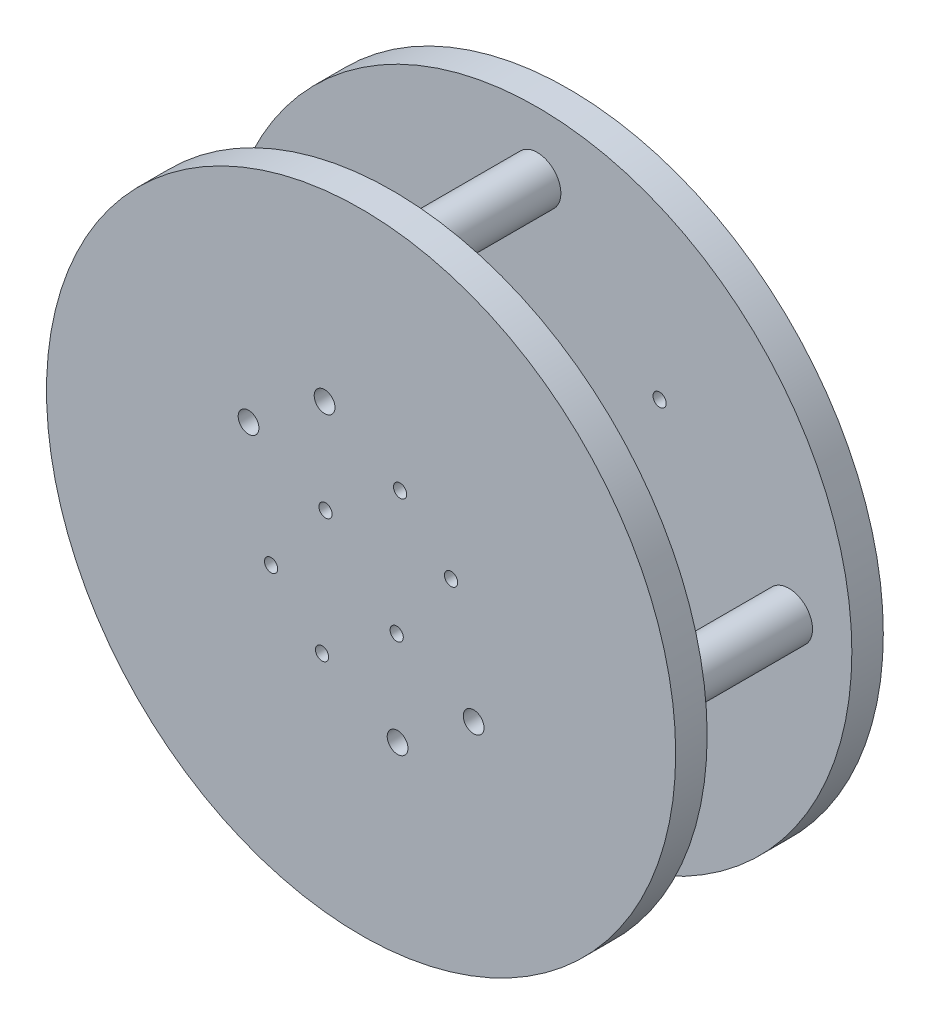
ISO-10303-21;
HEADER;
FILE_DESCRIPTION(('STEP AP214'),'2;1');
FILE_NAME('part.step','',(''),(''),'','','');
FILE_SCHEMA(('AUTOMOTIVE_DESIGN { 1 0 10303 214 1 1 1 1 }'));
ENDSEC;
DATA;
#1=APPLICATION_CONTEXT('core data for automotive mechanical design processes');
#2=APPLICATION_PROTOCOL_DEFINITION('international standard','automotive_design',2000,#1);
#3=PRODUCT_CONTEXT('',#1,'mechanical');
#4=PRODUCT('Part','Part','',(#3));
#5=PRODUCT_RELATED_PRODUCT_CATEGORY('part','',(#4));
#6=PRODUCT_DEFINITION_FORMATION('','',#4);
#7=PRODUCT_DEFINITION_CONTEXT('part definition',#1,'design');
#8=PRODUCT_DEFINITION('design','',#6,#7);
#9=PRODUCT_DEFINITION_SHAPE('','',#8);
#10=(LENGTH_UNIT() NAMED_UNIT(*) SI_UNIT(.MILLI.,.METRE.));
#11=(NAMED_UNIT(*) PLANE_ANGLE_UNIT() SI_UNIT($,.RADIAN.));
#12=(NAMED_UNIT(*) SI_UNIT($,.STERADIAN.) SOLID_ANGLE_UNIT());
#13=UNCERTAINTY_MEASURE_WITH_UNIT(LENGTH_MEASURE(1.E-05),#10,'distance_accuracy_value','');
#14=(GEOMETRIC_REPRESENTATION_CONTEXT(3) GLOBAL_UNCERTAINTY_ASSIGNED_CONTEXT((#13)) GLOBAL_UNIT_ASSIGNED_CONTEXT((#10,
#11,#12)) REPRESENTATION_CONTEXT('',''));
#15=CARTESIAN_POINT('',(0.,0.,0.));
#16=DIRECTION('',(0.,0.,1.));
#17=DIRECTION('',(1.,0.,0.));
#18=AXIS2_PLACEMENT_3D('',#15,#16,#17);
#19=CARTESIAN_POINT('',(0.,0.,10.));
#20=DIRECTION('',(0.,0.,1.));
#21=DIRECTION('',(1.,0.,0.));
#22=AXIS2_PLACEMENT_3D('',#19,#20,#21);
#23=PLANE('',#22);
#24=CARTESIAN_POINT('',(38.8908729652598,38.8908729652604,10.));
#25=DIRECTION('',(0.,0.,1.));
#26=DIRECTION('',(1.,0.,0.));
#27=AXIS2_PLACEMENT_3D('',#24,#25,#26);
#28=CIRCLE('',#27,2.09999999999998);
#29=CARTESIAN_POINT('',(40.9908729652598,38.8908729652604,10.));
#30=VERTEX_POINT('',#29);
#31=EDGE_CURVE('E527',#30,#30,#28,.T.);
#32=ORIENTED_EDGE('',*,*,#31,.F.);
#33=EDGE_LOOP('',(#32));
#34=FACE_BOUND('',#33,.T.);
#35=CARTESIAN_POINT('',(38.89087296526,-38.8908729652602,10.));
#36=DIRECTION('',(0.,0.,1.));
#37=DIRECTION('',(1.,0.,0.));
#38=AXIS2_PLACEMENT_3D('',#35,#36,#37);
#39=CIRCLE('',#38,2.09999999999998);
#40=CARTESIAN_POINT('',(40.99087296526,-38.8908729652602,10.));
#41=VERTEX_POINT('',#40);
#42=EDGE_CURVE('E529',#41,#41,#39,.T.);
#43=ORIENTED_EDGE('',*,*,#42,.F.);
#44=EDGE_LOOP('',(#43));
#45=FACE_BOUND('',#44,.T.);
#46=CARTESIAN_POINT('',(-38.89087296526,-38.8908729652602,10.));
#47=DIRECTION('',(0.,0.,1.));
#48=DIRECTION('',(1.,0.,0.));
#49=AXIS2_PLACEMENT_3D('',#46,#47,#48);
#50=CIRCLE('',#49,2.09999999999999);
#51=CARTESIAN_POINT('',(-36.7908729652601,-38.8908729652602,10.));
#52=VERTEX_POINT('',#51);
#53=EDGE_CURVE('E535',#52,#52,#50,.T.);
#54=ORIENTED_EDGE('',*,*,#53,.F.);
#55=EDGE_LOOP('',(#54));
#56=FACE_BOUND('',#55,.T.);
#57=CARTESIAN_POINT('',(-38.89087296526,38.8908729652602,10.));
#58=DIRECTION('',(0.,0.,1.));
#59=DIRECTION('',(1.,0.,0.));
#60=AXIS2_PLACEMENT_3D('',#57,#58,#59);
#61=CIRCLE('',#60,2.09999999999998);
#62=CARTESIAN_POINT('',(-36.7908729652601,38.8908729652602,10.));
#63=VERTEX_POINT('',#62);
#64=EDGE_CURVE('E538',#63,#63,#61,.T.);
#65=ORIENTED_EDGE('',*,*,#64,.F.);
#66=EDGE_LOOP('',(#65));
#67=FACE_BOUND('',#66,.T.);
#68=CARTESIAN_POINT('',(-28.6095403668078,-12.402652942012,10.));
#69=DIRECTION('',(0.,0.,1.));
#70=DIRECTION('',(1.,0.,0.));
#71=AXIS2_PLACEMENT_3D('',#68,#69,#70);
#72=CIRCLE('',#71,2.1);
#73=CARTESIAN_POINT('',(-26.5095403668078,-12.402652942012,10.));
#74=VERTEX_POINT('',#73);
#75=EDGE_CURVE('E72',#74,#74,#72,.F.);
#76=ORIENTED_EDGE('',*,*,#75,.T.);
#77=EDGE_LOOP('',(#76));
#78=FACE_BOUND('',#77,.T.);
#79=CARTESIAN_POINT('',(28.6095403668077,12.402652942012,10.));
#80=DIRECTION('',(0.,0.,1.));
#81=DIRECTION('',(1.,0.,0.));
#82=AXIS2_PLACEMENT_3D('',#79,#80,#81);
#83=CIRCLE('',#82,2.09999999999999);
#84=CARTESIAN_POINT('',(30.7095403668077,12.402652942012,10.));
#85=VERTEX_POINT('',#84);
#86=EDGE_CURVE('E53',#85,#85,#83,.F.);
#87=ORIENTED_EDGE('',*,*,#86,.T.);
#88=EDGE_LOOP('',(#87));
#89=FACE_BOUND('',#88,.T.);
#90=CARTESIAN_POINT('',(-8.37955521322352E-13,-80.,10.));
#91=DIRECTION('',(0.,0.,1.));
#92=DIRECTION('',(1.,0.,0.));
#93=AXIS2_PLACEMENT_3D('',#90,#91,#92);
#94=CIRCLE('',#93,7.50000000000002);
#95=CARTESIAN_POINT('',(7.49999999999918,-80.,10.));
#96=VERTEX_POINT('',#95);
#97=EDGE_CURVE('E91',#96,#96,#94,.T.);
#98=ORIENTED_EDGE('',*,*,#97,.F.);
#99=EDGE_LOOP('',(#98));
#100=FACE_BOUND('',#99,.T.);
#101=CARTESIAN_POINT('',(80.,-5.58637014214901E-13,10.));
#102=DIRECTION('',(0.,0.,1.));
#103=DIRECTION('',(1.,0.,0.));
#104=AXIS2_PLACEMENT_3D('',#101,#102,#103);
#105=CIRCLE('',#104,7.50000000000001);
#106=CARTESIAN_POINT('',(87.5,-5.58637014214901E-13,10.));
#107=VERTEX_POINT('',#106);
#108=EDGE_CURVE('E97',#107,#107,#105,.T.);
#109=ORIENTED_EDGE('',*,*,#108,.F.);
#110=EDGE_LOOP('',(#109));
#111=FACE_BOUND('',#110,.T.);
#112=CARTESIAN_POINT('',(2.79318507107451E-13,80.,10.));
#113=DIRECTION('',(0.,0.,1.));
#114=DIRECTION('',(1.,0.,0.));
#115=AXIS2_PLACEMENT_3D('',#112,#113,#114);
#116=CIRCLE('',#115,7.50000000000002);
#117=CARTESIAN_POINT('',(7.5000000000003,80.,10.));
#118=VERTEX_POINT('',#117);
#119=EDGE_CURVE('E103',#118,#118,#116,.T.);
#120=ORIENTED_EDGE('',*,*,#119,.F.);
#121=EDGE_LOOP('',(#120));
#122=FACE_BOUND('',#121,.T.);
#123=CARTESIAN_POINT('',(-80.,0.,10.));
#124=DIRECTION('',(0.,0.,1.));
#125=DIRECTION('',(1.,0.,0.));
#126=AXIS2_PLACEMENT_3D('',#123,#124,#125);
#127=CIRCLE('',#126,7.50000000000001);
#128=CARTESIAN_POINT('',(-72.5,0.,10.));
#129=VERTEX_POINT('',#128);
#130=EDGE_CURVE('E47',#129,#129,#127,.T.);
#131=ORIENTED_EDGE('',*,*,#130,.F.);
#132=EDGE_LOOP('',(#131));
#133=FACE_BOUND('',#132,.T.);
#134=CARTESIAN_POINT('',(0.,0.,10.));
#135=DIRECTION('',(0.,0.,1.));
#136=DIRECTION('',(1.,0.,0.));
#137=AXIS2_PLACEMENT_3D('',#134,#135,#136);
#138=CIRCLE('',#137,100.);
#139=CARTESIAN_POINT('',(100.,0.,10.));
#140=VERTEX_POINT('',#139);
#141=EDGE_CURVE('E10',#140,#140,#138,.T.);
#142=ORIENTED_EDGE('',*,*,#141,.T.);
#143=EDGE_LOOP('',(#142));
#144=FACE_BOUND('',#143,.T.);
#145=CARTESIAN_POINT('',(12.402652942012,28.6095403668077,10.));
#146=DIRECTION('',(0.,0.,1.));
#147=DIRECTION('',(1.,0.,0.));
#148=AXIS2_PLACEMENT_3D('',#145,#146,#147);
#149=CIRCLE('',#148,2.1);
#150=CARTESIAN_POINT('',(14.502652942012,28.6095403668077,10.));
#151=VERTEX_POINT('',#150);
#152=EDGE_CURVE('E57',#151,#151,#149,.T.);
#153=ORIENTED_EDGE('',*,*,#152,.F.);
#154=EDGE_LOOP('',(#153));
#155=FACE_BOUND('',#154,.T.);
#156=CARTESIAN_POINT('',(-12.4026529420121,-28.6095403668077,10.));
#157=DIRECTION('',(0.,0.,1.));
#158=DIRECTION('',(1.,0.,0.));
#159=AXIS2_PLACEMENT_3D('',#156,#157,#158);
#160=CIRCLE('',#159,2.09999999999997);
#161=CARTESIAN_POINT('',(-10.3026529420121,-28.6095403668077,10.));
#162=VERTEX_POINT('',#161);
#163=EDGE_CURVE('E60',#162,#162,#160,.T.);
#164=ORIENTED_EDGE('',*,*,#163,.F.);
#165=EDGE_LOOP('',(#164));
#166=FACE_BOUND('',#165,.T.);
#167=ADVANCED_FACE('F31',(#34,#45,#56,#67,#78,#89,#100,#111,#122,#133,#144,#155,#166),#23,.T.);
#168=CARTESIAN_POINT('',(0.,0.,0.));
#169=DIRECTION('',(0.,0.,1.));
#170=DIRECTION('',(1.,0.,0.));
#171=AXIS2_PLACEMENT_3D('',#168,#169,#170);
#172=PLANE('',#171);
#173=CARTESIAN_POINT('',(38.8908729652598,38.8908729652604,0.));
#174=DIRECTION('',(0.,0.,1.));
#175=DIRECTION('',(1.,0.,0.));
#176=AXIS2_PLACEMENT_3D('',#173,#174,#175);
#177=CIRCLE('',#176,2.09999999999999);
#178=CARTESIAN_POINT('',(40.9908729652598,38.8908729652604,0.));
#179=VERTEX_POINT('',#178);
#180=EDGE_CURVE('E259',#179,#179,#177,.T.);
#181=ORIENTED_EDGE('',*,*,#180,.T.);
#182=EDGE_LOOP('',(#181));
#183=FACE_BOUND('',#182,.T.);
#184=CARTESIAN_POINT('',(38.89087296526,-38.8908729652602,0.));
#185=DIRECTION('',(0.,0.,1.));
#186=DIRECTION('',(1.,0.,0.));
#187=AXIS2_PLACEMENT_3D('',#184,#185,#186);
#188=CIRCLE('',#187,2.09999999999999);
#189=CARTESIAN_POINT('',(40.99087296526,-38.8908729652602,0.));
#190=VERTEX_POINT('',#189);
#191=EDGE_CURVE('E263',#190,#190,#188,.T.);
#192=ORIENTED_EDGE('',*,*,#191,.T.);
#193=EDGE_LOOP('',(#192));
#194=FACE_BOUND('',#193,.T.);
#195=CARTESIAN_POINT('',(-38.89087296526,-38.8908729652602,0.));
#196=DIRECTION('',(0.,0.,1.));
#197=DIRECTION('',(1.,0.,0.));
#198=AXIS2_PLACEMENT_3D('',#195,#196,#197);
#199=CIRCLE('',#198,2.09999999999999);
#200=CARTESIAN_POINT('',(-36.7908729652601,-38.8908729652602,0.));
#201=VERTEX_POINT('',#200);
#202=EDGE_CURVE('E267',#201,#201,#199,.T.);
#203=ORIENTED_EDGE('',*,*,#202,.T.);
#204=EDGE_LOOP('',(#203));
#205=FACE_BOUND('',#204,.T.);
#206=CARTESIAN_POINT('',(-38.89087296526,38.8908729652602,0.));
#207=DIRECTION('',(0.,0.,1.));
#208=DIRECTION('',(1.,0.,0.));
#209=AXIS2_PLACEMENT_3D('',#206,#207,#208);
#210=CIRCLE('',#209,2.09999999999999);
#211=CARTESIAN_POINT('',(-36.79087296526,38.8908729652602,0.));
#212=VERTEX_POINT('',#211);
#213=EDGE_CURVE('E166',#212,#212,#210,.T.);
#214=ORIENTED_EDGE('',*,*,#213,.T.);
#215=EDGE_LOOP('',(#214));
#216=FACE_BOUND('',#215,.T.);
#217=CARTESIAN_POINT('',(-28.6095403668078,-12.402652942012,0.));
#218=DIRECTION('',(0.,0.,-1.));
#219=DIRECTION('',(-1.,0.,0.));
#220=AXIS2_PLACEMENT_3D('',#217,#218,#219);
#221=CIRCLE('',#220,2.1);
#222=CARTESIAN_POINT('',(-30.7095403668078,-12.402652942012,0.));
#223=VERTEX_POINT('',#222);
#224=EDGE_CURVE('E54',#223,#223,#221,.T.);
#225=ORIENTED_EDGE('',*,*,#224,.F.);
#226=EDGE_LOOP('',(#225));
#227=FACE_BOUND('',#226,.T.);
#228=CARTESIAN_POINT('',(12.402652942012,28.6095403668077,0.));
#229=DIRECTION('',(0.,0.,1.));
#230=DIRECTION('',(1.,0.,0.));
#231=AXIS2_PLACEMENT_3D('',#228,#229,#230);
#232=CIRCLE('',#231,2.1);
#233=CARTESIAN_POINT('',(14.502652942012,28.6095403668077,0.));
#234=VERTEX_POINT('',#233);
#235=EDGE_CURVE('E144',#234,#234,#232,.T.);
#236=ORIENTED_EDGE('',*,*,#235,.T.);
#237=EDGE_LOOP('',(#236));
#238=FACE_BOUND('',#237,.T.);
#239=CARTESIAN_POINT('',(28.6095403668077,12.402652942012,0.));
#240=DIRECTION('',(0.,0.,-1.));
#241=DIRECTION('',(-1.,0.,0.));
#242=AXIS2_PLACEMENT_3D('',#239,#240,#241);
#243=CIRCLE('',#242,2.09999999999999);
#244=CARTESIAN_POINT('',(26.5095403668077,12.402652942012,0.));
#245=VERTEX_POINT('',#244);
#246=EDGE_CURVE('E152',#245,#245,#243,.T.);
#247=ORIENTED_EDGE('',*,*,#246,.F.);
#248=EDGE_LOOP('',(#247));
#249=FACE_BOUND('',#248,.T.);
#250=CARTESIAN_POINT('',(0.,0.,0.));
#251=DIRECTION('',(0.,0.,1.));
#252=DIRECTION('',(1.,0.,0.));
#253=AXIS2_PLACEMENT_3D('',#250,#251,#252);
#254=CIRCLE('',#253,100.);
#255=CARTESIAN_POINT('',(100.,0.,0.));
#256=VERTEX_POINT('',#255);
#257=EDGE_CURVE('E39',#256,#256,#254,.T.);
#258=ORIENTED_EDGE('',*,*,#257,.F.);
#259=EDGE_LOOP('',(#258));
#260=FACE_BOUND('',#259,.T.);
#261=CARTESIAN_POINT('',(-12.4026529420121,-28.6095403668077,0.));
#262=DIRECTION('',(0.,0.,1.));
#263=DIRECTION('',(1.,0.,0.));
#264=AXIS2_PLACEMENT_3D('',#261,#262,#263);
#265=CIRCLE('',#264,2.09999999999997);
#266=CARTESIAN_POINT('',(-10.3026529420121,-28.6095403668077,0.));
#267=VERTEX_POINT('',#266);
#268=EDGE_CURVE('E135',#267,#267,#265,.T.);
#269=ORIENTED_EDGE('',*,*,#268,.T.);
#270=EDGE_LOOP('',(#269));
#271=FACE_BOUND('',#270,.T.);
#272=ADVANCED_FACE('F119',(#183,#194,#205,#216,#227,#238,#249,#260,#271),#172,.F.);
#273=CARTESIAN_POINT('',(0.,0.,66.));
#274=DIRECTION('',(0.,0.,1.));
#275=DIRECTION('',(1.,0.,0.));
#276=AXIS2_PLACEMENT_3D('',#273,#274,#275);
#277=PLANE('',#276);
#278=CARTESIAN_POINT('',(-11.601229272386,41.1146139392022,66.));
#279=DIRECTION('',(0.,0.,1.));
#280=DIRECTION('',(1.,0.,0.));
#281=AXIS2_PLACEMENT_3D('',#278,#279,#280);
#282=CIRCLE('',#281,3.29999999999999);
#283=CARTESIAN_POINT('',(-8.30122927238597,41.1146139392022,66.));
#284=VERTEX_POINT('',#283);
#285=EDGE_CURVE('E158',#284,#284,#282,.T.);
#286=ORIENTED_EDGE('',*,*,#285,.F.);
#287=EDGE_LOOP('',(#286));
#288=FACE_BOUND('',#287,.T.);
#289=CARTESIAN_POINT('',(-35.7749188912724,23.3485583778306,66.));
#290=DIRECTION('',(0.,0.,1.));
#291=DIRECTION('',(1.,0.,0.));
#292=AXIS2_PLACEMENT_3D('',#289,#290,#291);
#293=CIRCLE('',#292,3.3);
#294=CARTESIAN_POINT('',(-32.4749188912724,23.3485583778306,66.));
#295=VERTEX_POINT('',#294);
#296=EDGE_CURVE('E171',#295,#295,#293,.T.);
#297=ORIENTED_EDGE('',*,*,#296,.F.);
#298=EDGE_LOOP('',(#297));
#299=FACE_BOUND('',#298,.T.);
#300=CARTESIAN_POINT('',(11.6012292723852,-41.1146139391999,66.));
#301=DIRECTION('',(0.,0.,1.));
#302=DIRECTION('',(1.,0.,0.));
#303=AXIS2_PLACEMENT_3D('',#300,#301,#302);
#304=CIRCLE('',#303,3.3);
#305=CARTESIAN_POINT('',(14.9012292723852,-41.1146139391999,66.));
#306=VERTEX_POINT('',#305);
#307=EDGE_CURVE('E177',#306,#306,#304,.T.);
#308=ORIENTED_EDGE('',*,*,#307,.F.);
#309=EDGE_LOOP('',(#308));
#310=FACE_BOUND('',#309,.T.);
#311=CARTESIAN_POINT('',(35.7749188912716,-23.3485583778283,66.));
#312=DIRECTION('',(0.,0.,1.));
#313=DIRECTION('',(1.,0.,0.));
#314=AXIS2_PLACEMENT_3D('',#311,#312,#313);
#315=CIRCLE('',#314,3.29999999999999);
#316=CARTESIAN_POINT('',(39.0749188912716,-23.3485583778283,66.));
#317=VERTEX_POINT('',#316);
#318=EDGE_CURVE('E183',#317,#317,#315,.T.);
#319=ORIENTED_EDGE('',*,*,#318,.F.);
#320=EDGE_LOOP('',(#319));
#321=FACE_BOUND('',#320,.T.);
#322=CARTESIAN_POINT('',(-28.6095403668078,-12.402652942012,66.));
#323=DIRECTION('',(0.,0.,-1.));
#324=DIRECTION('',(-1.,0.,0.));
#325=AXIS2_PLACEMENT_3D('',#322,#323,#324);
#326=CIRCLE('',#325,2.1);
#327=CARTESIAN_POINT('',(-30.7095403668078,-12.402652942012,66.));
#328=VERTEX_POINT('',#327);
#329=EDGE_CURVE('E141',#328,#328,#326,.T.);
#330=ORIENTED_EDGE('',*,*,#329,.T.);
#331=EDGE_LOOP('',(#330));
#332=FACE_BOUND('',#331,.T.);
#333=CARTESIAN_POINT('',(28.6095403668077,12.402652942012,66.));
#334=DIRECTION('',(0.,0.,-1.));
#335=DIRECTION('',(-1.,0.,0.));
#336=AXIS2_PLACEMENT_3D('',#333,#334,#335);
#337=CIRCLE('',#336,2.09999999999999);
#338=CARTESIAN_POINT('',(26.5095403668077,12.402652942012,66.));
#339=VERTEX_POINT('',#338);
#340=EDGE_CURVE('E150',#339,#339,#337,.T.);
#341=ORIENTED_EDGE('',*,*,#340,.T.);
#342=EDGE_LOOP('',(#341));
#343=FACE_BOUND('',#342,.T.);
#344=CARTESIAN_POINT('',(-11.3137084989848,11.3137084989848,66.));
#345=DIRECTION('',(0.,0.,1.));
#346=DIRECTION('',(1.,0.,0.));
#347=AXIS2_PLACEMENT_3D('',#344,#345,#346);
#348=CIRCLE('',#347,2.1);
#349=CARTESIAN_POINT('',(-9.21370849898477,11.3137084989848,66.));
#350=VERTEX_POINT('',#349);
#351=EDGE_CURVE('E80',#350,#350,#348,.T.);
#352=ORIENTED_EDGE('',*,*,#351,.F.);
#353=EDGE_LOOP('',(#352));
#354=FACE_BOUND('',#353,.T.);
#355=CARTESIAN_POINT('',(11.3137084989848,-11.3137084989848,66.));
#356=DIRECTION('',(0.,0.,1.));
#357=DIRECTION('',(1.,0.,0.));
#358=AXIS2_PLACEMENT_3D('',#355,#356,#357);
#359=CIRCLE('',#358,2.1);
#360=CARTESIAN_POINT('',(13.4137084989848,-11.3137084989848,66.));
#361=VERTEX_POINT('',#360);
#362=EDGE_CURVE('E83',#361,#361,#359,.T.);
#363=ORIENTED_EDGE('',*,*,#362,.F.);
#364=EDGE_LOOP('',(#363));
#365=FACE_BOUND('',#364,.T.);
#366=CARTESIAN_POINT('',(0.,0.,66.));
#367=DIRECTION('',(0.,0.,1.));
#368=DIRECTION('',(1.,0.,0.));
#369=AXIS2_PLACEMENT_3D('',#366,#367,#368);
#370=CIRCLE('',#369,100.);
#371=CARTESIAN_POINT('',(100.,0.,66.));
#372=VERTEX_POINT('',#371);
#373=EDGE_CURVE('E88',#372,#372,#370,.T.);
#374=ORIENTED_EDGE('',*,*,#373,.T.);
#375=EDGE_LOOP('',(#374));
#376=FACE_BOUND('',#375,.T.);
#377=CARTESIAN_POINT('',(12.402652942012,28.6095403668077,66.));
#378=DIRECTION('',(0.,0.,1.));
#379=DIRECTION('',(1.,0.,0.));
#380=AXIS2_PLACEMENT_3D('',#377,#378,#379);
#381=CIRCLE('',#380,2.1);
#382=CARTESIAN_POINT('',(14.502652942012,28.6095403668077,66.));
#383=VERTEX_POINT('',#382);
#384=EDGE_CURVE('E138',#383,#383,#381,.T.);
#385=ORIENTED_EDGE('',*,*,#384,.F.);
#386=EDGE_LOOP('',(#385));
#387=FACE_BOUND('',#386,.T.);
#388=CARTESIAN_POINT('',(-12.4026529420121,-28.6095403668077,66.));
#389=DIRECTION('',(0.,0.,1.));
#390=DIRECTION('',(1.,0.,0.));
#391=AXIS2_PLACEMENT_3D('',#388,#389,#390);
#392=CIRCLE('',#391,2.09999999999997);
#393=CARTESIAN_POINT('',(-10.3026529420121,-28.6095403668077,66.));
#394=VERTEX_POINT('',#393);
#395=EDGE_CURVE('E137',#394,#394,#392,.T.);
#396=ORIENTED_EDGE('',*,*,#395,.F.);
#397=EDGE_LOOP('',(#396));
#398=FACE_BOUND('',#397,.T.);
#399=ADVANCED_FACE('F190',(#288,#299,#310,#321,#332,#343,#354,#365,#376,#387,#398),#277,.T.);
#400=CARTESIAN_POINT('',(0.,0.,56.));
#401=DIRECTION('',(0.,0.,1.));
#402=DIRECTION('',(1.,0.,0.));
#403=AXIS2_PLACEMENT_3D('',#400,#401,#402);
#404=PLANE('',#403);
#405=CARTESIAN_POINT('',(-28.6095403668078,-12.402652942012,56.));
#406=DIRECTION('',(0.,0.,1.));
#407=DIRECTION('',(1.,0.,0.));
#408=AXIS2_PLACEMENT_3D('',#405,#406,#407);
#409=CIRCLE('',#408,2.1);
#410=CARTESIAN_POINT('',(-26.5095403668078,-12.402652942012,56.));
#411=VERTEX_POINT('',#410);
#412=EDGE_CURVE('E35',#411,#411,#409,.F.);
#413=ORIENTED_EDGE('',*,*,#412,.F.);
#414=EDGE_LOOP('',(#413));
#415=FACE_BOUND('',#414,.T.);
#416=CARTESIAN_POINT('',(12.402652942012,28.6095403668077,56.));
#417=DIRECTION('',(0.,0.,1.));
#418=DIRECTION('',(1.,0.,0.));
#419=AXIS2_PLACEMENT_3D('',#416,#417,#418);
#420=CIRCLE('',#419,2.1);
#421=CARTESIAN_POINT('',(14.502652942012,28.6095403668077,56.));
#422=VERTEX_POINT('',#421);
#423=EDGE_CURVE('E55',#422,#422,#420,.T.);
#424=ORIENTED_EDGE('',*,*,#423,.T.);
#425=EDGE_LOOP('',(#424));
#426=FACE_BOUND('',#425,.T.);
#427=CARTESIAN_POINT('',(28.6095403668077,12.402652942012,56.));
#428=DIRECTION('',(0.,0.,1.));
#429=DIRECTION('',(1.,0.,0.));
#430=AXIS2_PLACEMENT_3D('',#427,#428,#429);
#431=CIRCLE('',#430,2.09999999999999);
#432=CARTESIAN_POINT('',(30.7095403668077,12.402652942012,56.));
#433=VERTEX_POINT('',#432);
#434=EDGE_CURVE('E50',#433,#433,#431,.F.);
#435=ORIENTED_EDGE('',*,*,#434,.F.);
#436=EDGE_LOOP('',(#435));
#437=FACE_BOUND('',#436,.T.);
#438=CARTESIAN_POINT('',(-11.3137084989848,11.3137084989848,56.));
#439=DIRECTION('',(0.,0.,1.));
#440=DIRECTION('',(1.,0.,0.));
#441=AXIS2_PLACEMENT_3D('',#438,#439,#440);
#442=CIRCLE('',#441,2.1);
#443=CARTESIAN_POINT('',(-9.21370849898477,11.3137084989848,56.));
#444=VERTEX_POINT('',#443);
#445=EDGE_CURVE('E76',#444,#444,#442,.T.);
#446=ORIENTED_EDGE('',*,*,#445,.T.);
#447=EDGE_LOOP('',(#446));
#448=FACE_BOUND('',#447,.T.);
#449=CARTESIAN_POINT('',(11.3137084989848,-11.3137084989848,56.));
#450=DIRECTION('',(0.,0.,1.));
#451=DIRECTION('',(1.,0.,0.));
#452=AXIS2_PLACEMENT_3D('',#449,#450,#451);
#453=CIRCLE('',#452,2.1);
#454=CARTESIAN_POINT('',(13.4137084989848,-11.3137084989848,56.));
#455=VERTEX_POINT('',#454);
#456=EDGE_CURVE('E75',#455,#455,#453,.T.);
#457=ORIENTED_EDGE('',*,*,#456,.T.);
#458=EDGE_LOOP('',(#457));
#459=FACE_BOUND('',#458,.T.);
#460=CARTESIAN_POINT('',(-80.,0.,56.));
#461=DIRECTION('',(0.,0.,1.));
#462=DIRECTION('',(1.,0.,0.));
#463=AXIS2_PLACEMENT_3D('',#460,#461,#462);
#464=CIRCLE('',#463,7.50000000000001);
#465=CARTESIAN_POINT('',(-72.5,0.,56.));
#466=VERTEX_POINT('',#465);
#467=EDGE_CURVE('E44',#466,#466,#464,.T.);
#468=ORIENTED_EDGE('',*,*,#467,.T.);
#469=EDGE_LOOP('',(#468));
#470=FACE_BOUND('',#469,.T.);
#471=CARTESIAN_POINT('',(2.79318507107451E-13,80.,56.));
#472=DIRECTION('',(0.,0.,1.));
#473=DIRECTION('',(1.,0.,0.));
#474=AXIS2_PLACEMENT_3D('',#471,#472,#473);
#475=CIRCLE('',#474,7.50000000000002);
#476=CARTESIAN_POINT('',(7.5000000000003,80.,56.));
#477=VERTEX_POINT('',#476);
#478=EDGE_CURVE('E106',#477,#477,#475,.T.);
#479=ORIENTED_EDGE('',*,*,#478,.T.);
#480=EDGE_LOOP('',(#479));
#481=FACE_BOUND('',#480,.T.);
#482=CARTESIAN_POINT('',(80.,-5.58637014214901E-13,56.));
#483=DIRECTION('',(0.,0.,1.));
#484=DIRECTION('',(1.,0.,0.));
#485=AXIS2_PLACEMENT_3D('',#482,#483,#484);
#486=CIRCLE('',#485,7.50000000000001);
#487=CARTESIAN_POINT('',(87.5,-5.58637014214901E-13,56.));
#488=VERTEX_POINT('',#487);
#489=EDGE_CURVE('E100',#488,#488,#486,.T.);
#490=ORIENTED_EDGE('',*,*,#489,.T.);
#491=EDGE_LOOP('',(#490));
#492=FACE_BOUND('',#491,.T.);
#493=CARTESIAN_POINT('',(-8.37955521322352E-13,-80.,56.));
#494=DIRECTION('',(0.,0.,1.));
#495=DIRECTION('',(1.,0.,0.));
#496=AXIS2_PLACEMENT_3D('',#493,#494,#495);
#497=CIRCLE('',#496,7.50000000000002);
#498=CARTESIAN_POINT('',(7.49999999999918,-80.,56.));
#499=VERTEX_POINT('',#498);
#500=EDGE_CURVE('E94',#499,#499,#497,.T.);
#501=ORIENTED_EDGE('',*,*,#500,.T.);
#502=EDGE_LOOP('',(#501));
#503=FACE_BOUND('',#502,.T.);
#504=CARTESIAN_POINT('',(0.,0.,56.));
#505=DIRECTION('',(0.,0.,1.));
#506=DIRECTION('',(1.,0.,0.));
#507=AXIS2_PLACEMENT_3D('',#504,#505,#506);
#508=CIRCLE('',#507,100.);
#509=CARTESIAN_POINT('',(100.,0.,56.));
#510=VERTEX_POINT('',#509);
#511=EDGE_CURVE('E79',#510,#510,#508,.T.);
#512=ORIENTED_EDGE('',*,*,#511,.F.);
#513=EDGE_LOOP('',(#512));
#514=FACE_BOUND('',#513,.T.);
#515=CARTESIAN_POINT('',(-12.4026529420121,-28.6095403668077,56.));
#516=DIRECTION('',(0.,0.,1.));
#517=DIRECTION('',(1.,0.,0.));
#518=AXIS2_PLACEMENT_3D('',#515,#516,#517);
#519=CIRCLE('',#518,2.09999999999997);
#520=CARTESIAN_POINT('',(-10.3026529420121,-28.6095403668077,56.));
#521=VERTEX_POINT('',#520);
#522=EDGE_CURVE('E58',#521,#521,#519,.T.);
#523=ORIENTED_EDGE('',*,*,#522,.T.);
#524=EDGE_LOOP('',(#523));
#525=FACE_BOUND('',#524,.T.);
#526=ADVANCED_FACE('F201',(#415,#426,#437,#448,#459,#470,#481,#492,#503,#514,#525),#404,.F.);
#527=CARTESIAN_POINT('',(0.,0.,10.));
#528=DIRECTION('',(0.,0.,-1.));
#529=DIRECTION('',(-1.,0.,0.));
#530=AXIS2_PLACEMENT_3D('',#527,#528,#529);
#531=CYLINDRICAL_SURFACE('',#530,100.);
#532=ORIENTED_EDGE('',*,*,#141,.F.);
#533=EDGE_LOOP('',(#532));
#534=FACE_BOUND('',#533,.T.);
#535=ORIENTED_EDGE('',*,*,#257,.T.);
#536=EDGE_LOOP('',(#535));
#537=FACE_BOUND('',#536,.T.);
#538=ADVANCED_FACE('F33',(#534,#537),#531,.T.);
#539=CARTESIAN_POINT('',(-80.,0.,56.));
#540=DIRECTION('',(0.,0.,-1.));
#541=DIRECTION('',(-1.,0.,0.));
#542=AXIS2_PLACEMENT_3D('',#539,#540,#541);
#543=CYLINDRICAL_SURFACE('',#542,7.50000000000001);
#544=ORIENTED_EDGE('',*,*,#467,.F.);
#545=EDGE_LOOP('',(#544));
#546=FACE_BOUND('',#545,.T.);
#547=ORIENTED_EDGE('',*,*,#130,.T.);
#548=EDGE_LOOP('',(#547));
#549=FACE_BOUND('',#548,.T.);
#550=ADVANCED_FACE('F116',(#546,#549),#543,.T.);
#551=CARTESIAN_POINT('',(2.79318507107451E-13,80.,56.));
#552=DIRECTION('',(0.,0.,-1.));
#553=DIRECTION('',(-1.,0.,0.));
#554=AXIS2_PLACEMENT_3D('',#551,#552,#553);
#555=CYLINDRICAL_SURFACE('',#554,7.50000000000002);
#556=ORIENTED_EDGE('',*,*,#478,.F.);
#557=EDGE_LOOP('',(#556));
#558=FACE_BOUND('',#557,.T.);
#559=ORIENTED_EDGE('',*,*,#119,.T.);
#560=EDGE_LOOP('',(#559));
#561=FACE_BOUND('',#560,.T.);
#562=ADVANCED_FACE('F242',(#558,#561),#555,.T.);
#563=CARTESIAN_POINT('',(80.,-5.58637014214901E-13,56.));
#564=DIRECTION('',(0.,0.,-1.));
#565=DIRECTION('',(-1.,0.,0.));
#566=AXIS2_PLACEMENT_3D('',#563,#564,#565);
#567=CYLINDRICAL_SURFACE('',#566,7.50000000000001);
#568=ORIENTED_EDGE('',*,*,#489,.F.);
#569=EDGE_LOOP('',(#568));
#570=FACE_BOUND('',#569,.T.);
#571=ORIENTED_EDGE('',*,*,#108,.T.);
#572=EDGE_LOOP('',(#571));
#573=FACE_BOUND('',#572,.T.);
#574=ADVANCED_FACE('F234',(#570,#573),#567,.T.);
#575=CARTESIAN_POINT('',(-8.37955521322352E-13,-80.,56.));
#576=DIRECTION('',(0.,0.,-1.));
#577=DIRECTION('',(-1.,0.,0.));
#578=AXIS2_PLACEMENT_3D('',#575,#576,#577);
#579=CYLINDRICAL_SURFACE('',#578,7.50000000000002);
#580=ORIENTED_EDGE('',*,*,#500,.F.);
#581=EDGE_LOOP('',(#580));
#582=FACE_BOUND('',#581,.T.);
#583=ORIENTED_EDGE('',*,*,#97,.T.);
#584=EDGE_LOOP('',(#583));
#585=FACE_BOUND('',#584,.T.);
#586=ADVANCED_FACE('F224',(#582,#585),#579,.T.);
#587=CARTESIAN_POINT('',(0.,0.,66.));
#588=DIRECTION('',(0.,0.,-1.));
#589=DIRECTION('',(-1.,0.,0.));
#590=AXIS2_PLACEMENT_3D('',#587,#588,#589);
#591=CYLINDRICAL_SURFACE('',#590,100.);
#592=ORIENTED_EDGE('',*,*,#373,.F.);
#593=EDGE_LOOP('',(#592));
#594=FACE_BOUND('',#593,.T.);
#595=ORIENTED_EDGE('',*,*,#511,.T.);
#596=EDGE_LOOP('',(#595));
#597=FACE_BOUND('',#596,.T.);
#598=ADVANCED_FACE('F221',(#594,#597),#591,.T.);
#599=CARTESIAN_POINT('',(11.3137084989848,-11.3137084989848,56.));
#600=DIRECTION('',(0.,0.,1.));
#601=DIRECTION('',(1.,0.,0.));
#602=AXIS2_PLACEMENT_3D('',#599,#600,#601);
#603=CYLINDRICAL_SURFACE('',#602,2.1);
#604=ORIENTED_EDGE('',*,*,#456,.F.);
#605=EDGE_LOOP('',(#604));
#606=FACE_BOUND('',#605,.T.);
#607=ORIENTED_EDGE('',*,*,#362,.T.);
#608=EDGE_LOOP('',(#607));
#609=FACE_BOUND('',#608,.T.);
#610=ADVANCED_FACE('F223',(#606,#609),#603,.F.);
#611=CARTESIAN_POINT('',(-11.3137084989848,11.3137084989848,56.));
#612=DIRECTION('',(0.,0.,1.));
#613=DIRECTION('',(1.,0.,0.));
#614=AXIS2_PLACEMENT_3D('',#611,#612,#613);
#615=CYLINDRICAL_SURFACE('',#614,2.1);
#616=ORIENTED_EDGE('',*,*,#445,.F.);
#617=EDGE_LOOP('',(#616));
#618=FACE_BOUND('',#617,.T.);
#619=ORIENTED_EDGE('',*,*,#351,.T.);
#620=EDGE_LOOP('',(#619));
#621=FACE_BOUND('',#620,.T.);
#622=ADVANCED_FACE('F231',(#618,#621),#615,.F.);
#623=CARTESIAN_POINT('',(28.6095403668077,12.402652942012,0.));
#624=DIRECTION('',(0.,0.,1.));
#625=DIRECTION('',(1.,0.,0.));
#626=AXIS2_PLACEMENT_3D('',#623,#624,#625);
#627=CYLINDRICAL_SURFACE('',#626,2.09999999999999);
#628=ORIENTED_EDGE('',*,*,#340,.F.);
#629=EDGE_LOOP('',(#628));
#630=FACE_BOUND('',#629,.T.);
#631=ORIENTED_EDGE('',*,*,#434,.T.);
#632=EDGE_LOOP('',(#631));
#633=FACE_BOUND('',#632,.T.);
#634=ADVANCED_FACE('F318',(#630,#633),#627,.F.);
#635=CARTESIAN_POINT('',(12.402652942012,28.6095403668077,0.));
#636=DIRECTION('',(0.,0.,1.));
#637=DIRECTION('',(1.,0.,0.));
#638=AXIS2_PLACEMENT_3D('',#635,#636,#637);
#639=CYLINDRICAL_SURFACE('',#638,2.1);
#640=ORIENTED_EDGE('',*,*,#384,.T.);
#641=EDGE_LOOP('',(#640));
#642=FACE_BOUND('',#641,.T.);
#643=ORIENTED_EDGE('',*,*,#423,.F.);
#644=EDGE_LOOP('',(#643));
#645=FACE_BOUND('',#644,.T.);
#646=ADVANCED_FACE('F334',(#642,#645),#639,.F.);
#647=CARTESIAN_POINT('',(-12.4026529420121,-28.6095403668077,0.));
#648=DIRECTION('',(0.,0.,1.));
#649=DIRECTION('',(1.,0.,0.));
#650=AXIS2_PLACEMENT_3D('',#647,#648,#649);
#651=CYLINDRICAL_SURFACE('',#650,2.09999999999997);
#652=ORIENTED_EDGE('',*,*,#395,.T.);
#653=EDGE_LOOP('',(#652));
#654=FACE_BOUND('',#653,.T.);
#655=ORIENTED_EDGE('',*,*,#522,.F.);
#656=EDGE_LOOP('',(#655));
#657=FACE_BOUND('',#656,.T.);
#658=ADVANCED_FACE('F132',(#654,#657),#651,.F.);
#659=CARTESIAN_POINT('',(-28.6095403668078,-12.402652942012,0.));
#660=DIRECTION('',(0.,0.,1.));
#661=DIRECTION('',(1.,0.,0.));
#662=AXIS2_PLACEMENT_3D('',#659,#660,#661);
#663=CYLINDRICAL_SURFACE('',#662,2.1);
#664=ORIENTED_EDGE('',*,*,#329,.F.);
#665=EDGE_LOOP('',(#664));
#666=FACE_BOUND('',#665,.T.);
#667=ORIENTED_EDGE('',*,*,#412,.T.);
#668=EDGE_LOOP('',(#667));
#669=FACE_BOUND('',#668,.T.);
#670=ADVANCED_FACE('F193',(#666,#669),#663,.F.);
#671=ORIENTED_EDGE('',*,*,#86,.F.);
#672=EDGE_LOOP('',(#671));
#673=FACE_BOUND('',#672,.T.);
#674=ORIENTED_EDGE('',*,*,#246,.T.);
#675=EDGE_LOOP('',(#674));
#676=FACE_BOUND('',#675,.T.);
#677=ADVANCED_FACE('F196',(#673,#676),#627,.F.);
#678=ORIENTED_EDGE('',*,*,#152,.T.);
#679=EDGE_LOOP('',(#678));
#680=FACE_BOUND('',#679,.T.);
#681=ORIENTED_EDGE('',*,*,#235,.F.);
#682=EDGE_LOOP('',(#681));
#683=FACE_BOUND('',#682,.T.);
#684=ADVANCED_FACE('F130',(#680,#683),#639,.F.);
#685=ORIENTED_EDGE('',*,*,#163,.T.);
#686=EDGE_LOOP('',(#685));
#687=FACE_BOUND('',#686,.T.);
#688=ORIENTED_EDGE('',*,*,#268,.F.);
#689=EDGE_LOOP('',(#688));
#690=FACE_BOUND('',#689,.T.);
#691=ADVANCED_FACE('F126',(#687,#690),#651,.F.);
#692=ORIENTED_EDGE('',*,*,#75,.F.);
#693=EDGE_LOOP('',(#692));
#694=FACE_BOUND('',#693,.T.);
#695=ORIENTED_EDGE('',*,*,#224,.T.);
#696=EDGE_LOOP('',(#695));
#697=FACE_BOUND('',#696,.T.);
#698=ADVANCED_FACE('F129',(#694,#697),#663,.F.);
#699=CARTESIAN_POINT('',(35.7749188912716,-23.3485583778283,61.));
#700=DIRECTION('',(0.,0.,1.));
#701=DIRECTION('',(1.,0.,0.));
#702=AXIS2_PLACEMENT_3D('',#699,#700,#701);
#703=CYLINDRICAL_SURFACE('',#702,3.29999999999999);
#704=CARTESIAN_POINT('',(35.7749188912716,-23.3485583778283,61.));
#705=DIRECTION('',(0.,0.,1.));
#706=DIRECTION('',(1.,0.,0.));
#707=AXIS2_PLACEMENT_3D('',#704,#705,#706);
#708=CIRCLE('',#707,3.29999999999999);
#709=CARTESIAN_POINT('',(39.0749188912716,-23.3485583778283,61.));
#710=VERTEX_POINT('',#709);
#711=EDGE_CURVE('E180',#710,#710,#708,.T.);
#712=ORIENTED_EDGE('',*,*,#711,.F.);
#713=EDGE_LOOP('',(#712));
#714=FACE_BOUND('',#713,.T.);
#715=ORIENTED_EDGE('',*,*,#318,.T.);
#716=EDGE_LOOP('',(#715));
#717=FACE_BOUND('',#716,.T.);
#718=ADVANCED_FACE('F389',(#714,#717),#703,.F.);
#719=CARTESIAN_POINT('',(35.7749188912716,-23.3485583778283,61.));
#720=DIRECTION('',(0.,0.,1.));
#721=DIRECTION('',(1.,0.,0.));
#722=AXIS2_PLACEMENT_3D('',#719,#720,#721);
#723=PLANE('',#722);
#724=ORIENTED_EDGE('',*,*,#711,.T.);
#725=EDGE_LOOP('',(#724));
#726=FACE_BOUND('',#725,.T.);
#727=ADVANCED_FACE('F404',(#726),#723,.T.);
#728=CARTESIAN_POINT('',(11.6012292723852,-41.1146139391999,61.));
#729=DIRECTION('',(0.,0.,1.));
#730=DIRECTION('',(1.,0.,0.));
#731=AXIS2_PLACEMENT_3D('',#728,#729,#730);
#732=CYLINDRICAL_SURFACE('',#731,3.3);
#733=CARTESIAN_POINT('',(11.6012292723852,-41.1146139391999,61.));
#734=DIRECTION('',(0.,0.,1.));
#735=DIRECTION('',(1.,0.,0.));
#736=AXIS2_PLACEMENT_3D('',#733,#734,#735);
#737=CIRCLE('',#736,3.3);
#738=CARTESIAN_POINT('',(14.9012292723852,-41.1146139391999,61.));
#739=VERTEX_POINT('',#738);
#740=EDGE_CURVE('E174',#739,#739,#737,.T.);
#741=ORIENTED_EDGE('',*,*,#740,.F.);
#742=EDGE_LOOP('',(#741));
#743=FACE_BOUND('',#742,.T.);
#744=ORIENTED_EDGE('',*,*,#307,.T.);
#745=EDGE_LOOP('',(#744));
#746=FACE_BOUND('',#745,.T.);
#747=ADVANCED_FACE('F414',(#743,#746),#732,.F.);
#748=CARTESIAN_POINT('',(11.6012292723852,-41.1146139391999,61.));
#749=DIRECTION('',(0.,0.,1.));
#750=DIRECTION('',(1.,0.,0.));
#751=AXIS2_PLACEMENT_3D('',#748,#749,#750);
#752=PLANE('',#751);
#753=ORIENTED_EDGE('',*,*,#740,.T.);
#754=EDGE_LOOP('',(#753));
#755=FACE_BOUND('',#754,.T.);
#756=ADVANCED_FACE('F424',(#755),#752,.T.);
#757=CARTESIAN_POINT('',(-35.7749188912724,23.3485583778306,61.));
#758=DIRECTION('',(0.,0.,1.));
#759=DIRECTION('',(1.,0.,0.));
#760=AXIS2_PLACEMENT_3D('',#757,#758,#759);
#761=CYLINDRICAL_SURFACE('',#760,3.3);
#762=CARTESIAN_POINT('',(-35.7749188912724,23.3485583778306,61.));
#763=DIRECTION('',(0.,0.,1.));
#764=DIRECTION('',(1.,0.,0.));
#765=AXIS2_PLACEMENT_3D('',#762,#763,#764);
#766=CIRCLE('',#765,3.3);
#767=CARTESIAN_POINT('',(-32.4749188912724,23.3485583778306,61.));
#768=VERTEX_POINT('',#767);
#769=EDGE_CURVE('E163',#768,#768,#766,.T.);
#770=ORIENTED_EDGE('',*,*,#769,.F.);
#771=EDGE_LOOP('',(#770));
#772=FACE_BOUND('',#771,.T.);
#773=ORIENTED_EDGE('',*,*,#296,.T.);
#774=EDGE_LOOP('',(#773));
#775=FACE_BOUND('',#774,.T.);
#776=ADVANCED_FACE('F434',(#772,#775),#761,.F.);
#777=CARTESIAN_POINT('',(-35.7749188912724,23.3485583778306,61.));
#778=DIRECTION('',(0.,0.,1.));
#779=DIRECTION('',(1.,0.,0.));
#780=AXIS2_PLACEMENT_3D('',#777,#778,#779);
#781=PLANE('',#780);
#782=ORIENTED_EDGE('',*,*,#769,.T.);
#783=EDGE_LOOP('',(#782));
#784=FACE_BOUND('',#783,.T.);
#785=ADVANCED_FACE('F444',(#784),#781,.T.);
#786=CARTESIAN_POINT('',(-11.601229272386,41.1146139392022,61.));
#787=DIRECTION('',(0.,0.,1.));
#788=DIRECTION('',(1.,0.,0.));
#789=AXIS2_PLACEMENT_3D('',#786,#787,#788);
#790=CYLINDRICAL_SURFACE('',#789,3.29999999999999);
#791=CARTESIAN_POINT('',(-11.601229272386,41.1146139392022,61.));
#792=DIRECTION('',(0.,0.,1.));
#793=DIRECTION('',(1.,0.,0.));
#794=AXIS2_PLACEMENT_3D('',#791,#792,#793);
#795=CIRCLE('',#794,3.29999999999999);
#796=CARTESIAN_POINT('',(-8.30122927238597,41.1146139392022,61.));
#797=VERTEX_POINT('',#796);
#798=EDGE_CURVE('E154',#797,#797,#795,.T.);
#799=ORIENTED_EDGE('',*,*,#798,.F.);
#800=EDGE_LOOP('',(#799));
#801=FACE_BOUND('',#800,.T.);
#802=ORIENTED_EDGE('',*,*,#285,.T.);
#803=EDGE_LOOP('',(#802));
#804=FACE_BOUND('',#803,.T.);
#805=ADVANCED_FACE('F454',(#801,#804),#790,.F.);
#806=CARTESIAN_POINT('',(-11.601229272386,41.1146139392022,61.));
#807=DIRECTION('',(0.,0.,1.));
#808=DIRECTION('',(1.,0.,0.));
#809=AXIS2_PLACEMENT_3D('',#806,#807,#808);
#810=PLANE('',#809);
#811=ORIENTED_EDGE('',*,*,#798,.T.);
#812=EDGE_LOOP('',(#811));
#813=FACE_BOUND('',#812,.T.);
#814=ADVANCED_FACE('F464',(#813),#810,.T.);
#815=CARTESIAN_POINT('',(-38.89087296526,38.8908729652602,10.));
#816=DIRECTION('',(0.,0.,1.));
#817=DIRECTION('',(1.,0.,0.));
#818=AXIS2_PLACEMENT_3D('',#815,#816,#817);
#819=CYLINDRICAL_SURFACE('',#818,2.09999999999999);
#820=ORIENTED_EDGE('',*,*,#213,.F.);
#821=EDGE_LOOP('',(#820));
#822=FACE_BOUND('',#821,.T.);
#823=ORIENTED_EDGE('',*,*,#64,.T.);
#824=EDGE_LOOP('',(#823));
#825=FACE_BOUND('',#824,.T.);
#826=ADVANCED_FACE('F474',(#822,#825),#819,.F.);
#827=CARTESIAN_POINT('',(-38.89087296526,-38.8908729652602,10.));
#828=DIRECTION('',(0.,0.,1.));
#829=DIRECTION('',(1.,0.,0.));
#830=AXIS2_PLACEMENT_3D('',#827,#828,#829);
#831=CYLINDRICAL_SURFACE('',#830,2.09999999999999);
#832=ORIENTED_EDGE('',*,*,#202,.F.);
#833=EDGE_LOOP('',(#832));
#834=FACE_BOUND('',#833,.T.);
#835=ORIENTED_EDGE('',*,*,#53,.T.);
#836=EDGE_LOOP('',(#835));
#837=FACE_BOUND('',#836,.T.);
#838=ADVANCED_FACE('F482',(#834,#837),#831,.F.);
#839=CARTESIAN_POINT('',(38.89087296526,-38.8908729652602,10.));
#840=DIRECTION('',(0.,0.,1.));
#841=DIRECTION('',(1.,0.,0.));
#842=AXIS2_PLACEMENT_3D('',#839,#840,#841);
#843=CYLINDRICAL_SURFACE('',#842,2.09999999999999);
#844=ORIENTED_EDGE('',*,*,#191,.F.);
#845=EDGE_LOOP('',(#844));
#846=FACE_BOUND('',#845,.T.);
#847=ORIENTED_EDGE('',*,*,#42,.T.);
#848=EDGE_LOOP('',(#847));
#849=FACE_BOUND('',#848,.T.);
#850=ADVANCED_FACE('F500',(#846,#849),#843,.F.);
#851=CARTESIAN_POINT('',(38.8908729652598,38.8908729652604,10.));
#852=DIRECTION('',(0.,0.,1.));
#853=DIRECTION('',(1.,0.,0.));
#854=AXIS2_PLACEMENT_3D('',#851,#852,#853);
#855=CYLINDRICAL_SURFACE('',#854,2.09999999999999);
#856=ORIENTED_EDGE('',*,*,#180,.F.);
#857=EDGE_LOOP('',(#856));
#858=FACE_BOUND('',#857,.T.);
#859=ORIENTED_EDGE('',*,*,#31,.T.);
#860=EDGE_LOOP('',(#859));
#861=FACE_BOUND('',#860,.T.);
#862=ADVANCED_FACE('F507',(#858,#861),#855,.F.);
#863=CLOSED_SHELL('',(#167,#272,#399,#526,#538,#550,#562,#574,#586,#598,#610,#622,#634,#646,
#658,#670,#677,#684,#691,#698,#718,#727,#747,#756,#776,#785,#805,#814,#826,#838,#850,#862));
#864=MANIFOLD_SOLID_BREP('B2',#863);
#865=ADVANCED_BREP_SHAPE_REPRESENTATION('',(#18,#864),#14);
#866=SHAPE_DEFINITION_REPRESENTATION(#9,#865);
ENDSEC;
END-ISO-10303-21;
